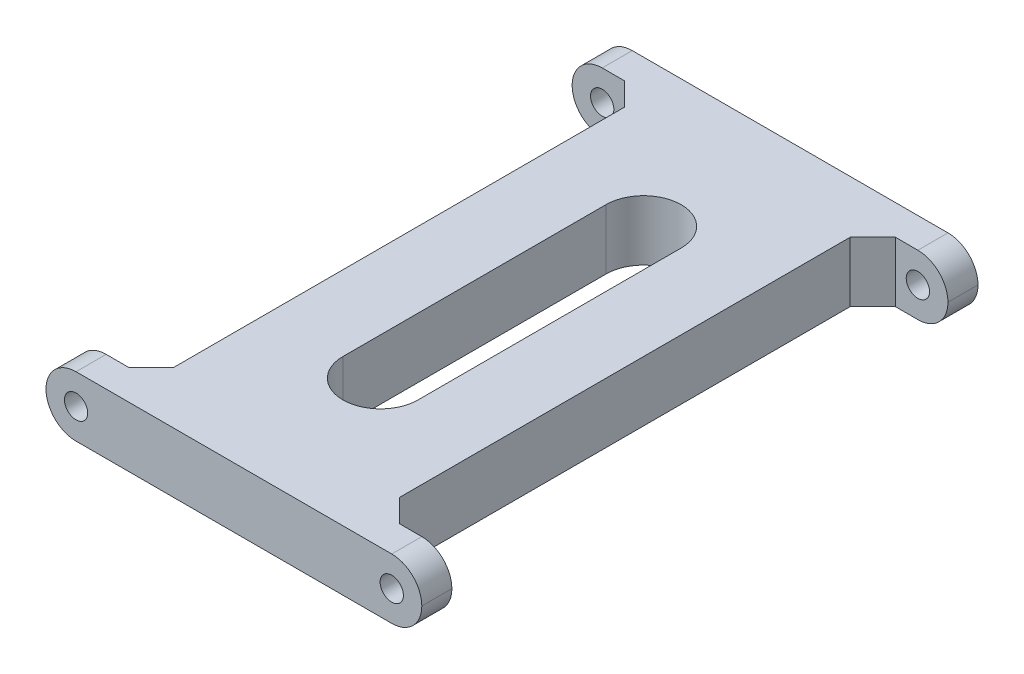
ISO-10303-21;
HEADER;
FILE_DESCRIPTION(('STEP AP214'),'2;1');
FILE_NAME('part.step','',(''),(''),'','','');
FILE_SCHEMA(('AUTOMOTIVE_DESIGN { 1 0 10303 214 1 1 1 1 }'));
ENDSEC;
DATA;
#1=APPLICATION_CONTEXT('core data for automotive mechanical design processes');
#2=APPLICATION_PROTOCOL_DEFINITION('international standard','automotive_design',2000,#1);
#3=PRODUCT_CONTEXT('',#1,'mechanical');
#4=PRODUCT('Part','Part','',(#3));
#5=PRODUCT_RELATED_PRODUCT_CATEGORY('part','',(#4));
#6=PRODUCT_DEFINITION_FORMATION('','',#4);
#7=PRODUCT_DEFINITION_CONTEXT('part definition',#1,'design');
#8=PRODUCT_DEFINITION('design','',#6,#7);
#9=PRODUCT_DEFINITION_SHAPE('','',#8);
#10=(LENGTH_UNIT() NAMED_UNIT(*) SI_UNIT(.MILLI.,.METRE.));
#11=(NAMED_UNIT(*) PLANE_ANGLE_UNIT() SI_UNIT($,.RADIAN.));
#12=(NAMED_UNIT(*) SI_UNIT($,.STERADIAN.) SOLID_ANGLE_UNIT());
#13=UNCERTAINTY_MEASURE_WITH_UNIT(LENGTH_MEASURE(1.E-05),#10,'distance_accuracy_value','');
#14=(GEOMETRIC_REPRESENTATION_CONTEXT(3) GLOBAL_UNCERTAINTY_ASSIGNED_CONTEXT((#13)) GLOBAL_UNIT_ASSIGNED_CONTEXT((#10,
#11,#12)) REPRESENTATION_CONTEXT('',''));
#15=CARTESIAN_POINT('',(0.,0.,0.));
#16=DIRECTION('',(0.,0.,1.));
#17=DIRECTION('',(1.,0.,0.));
#18=AXIS2_PLACEMENT_3D('',#15,#16,#17);
#19=CARTESIAN_POINT('',(0.,4.,0.));
#20=DIRECTION('',(0.,1.,0.));
#21=DIRECTION('',(0.,0.,1.));
#22=AXIS2_PLACEMENT_3D('',#19,#20,#21);
#23=PLANE('',#22);
#24=DIRECTION('',(-1.,0.,0.));
#25=VECTOR('',#24,1.);
#26=CARTESIAN_POINT('',(-25.,4.,-37.));
#27=LINE('',#26,#25);
#28=CARTESIAN_POINT('',(21.,4.,-37.));
#29=VERTEX_POINT('',#28);
#30=CARTESIAN_POINT('',(-21.,4.,-37.));
#31=VERTEX_POINT('',#30);
#32=EDGE_CURVE('E253',#29,#31,#27,.T.);
#33=ORIENTED_EDGE('',*,*,#32,.T.);
#34=DIRECTION('',(0.,0.,1.));
#35=VECTOR('',#34,1.);
#36=CARTESIAN_POINT('',(-21.,4.,-33.));
#37=LINE('',#36,#35);
#38=CARTESIAN_POINT('',(-21.,4.,-33.));
#39=VERTEX_POINT('',#38);
#40=EDGE_CURVE('E337',#31,#39,#37,.T.);
#41=ORIENTED_EDGE('',*,*,#40,.T.);
#42=DIRECTION('',(1.,0.,0.));
#43=VECTOR('',#42,1.);
#44=CARTESIAN_POINT('',(-25.,4.,-33.));
#45=LINE('',#44,#43);
#46=CARTESIAN_POINT('',(-18.,4.,-33.));
#47=VERTEX_POINT('',#46);
#48=EDGE_CURVE('E256',#39,#47,#45,.T.);
#49=ORIENTED_EDGE('',*,*,#48,.T.);
#50=DIRECTION('',(-0.707106781186543,0.,-0.707106781186552));
#51=VECTOR('',#50,1.);
#52=CARTESIAN_POINT('',(-15.,4.,-30.));
#53=LINE('',#52,#51);
#54=CARTESIAN_POINT('',(-15.,4.,-30.));
#55=VERTEX_POINT('',#54);
#56=EDGE_CURVE('E317',#47,#55,#53,.F.);
#57=ORIENTED_EDGE('',*,*,#56,.T.);
#58=DIRECTION('',(0.,0.,1.));
#59=VECTOR('',#58,1.);
#60=CARTESIAN_POINT('',(-15.,4.,-33.));
#61=LINE('',#60,#59);
#62=CARTESIAN_POINT('',(-15.,4.,30.));
#63=VERTEX_POINT('',#62);
#64=EDGE_CURVE('E258',#55,#63,#61,.T.);
#65=ORIENTED_EDGE('',*,*,#64,.T.);
#66=DIRECTION('',(0.707106781186553,0.,-0.707106781186542));
#67=VECTOR('',#66,1.);
#68=CARTESIAN_POINT('',(-18.,4.,33.));
#69=LINE('',#68,#67);
#70=CARTESIAN_POINT('',(-18.,4.,33.));
#71=VERTEX_POINT('',#70);
#72=EDGE_CURVE('E312',#63,#71,#69,.F.);
#73=ORIENTED_EDGE('',*,*,#72,.T.);
#74=DIRECTION('',(-1.,0.,0.));
#75=VECTOR('',#74,1.);
#76=CARTESIAN_POINT('',(-25.,4.,33.));
#77=LINE('',#76,#75);
#78=CARTESIAN_POINT('',(-21.,4.,33.));
#79=VERTEX_POINT('',#78);
#80=EDGE_CURVE('E261',#71,#79,#77,.T.);
#81=ORIENTED_EDGE('',*,*,#80,.T.);
#82=DIRECTION('',(0.,0.,1.));
#83=VECTOR('',#82,1.);
#84=CARTESIAN_POINT('',(-21.,4.,37.));
#85=LINE('',#84,#83);
#86=CARTESIAN_POINT('',(-21.,4.,37.));
#87=VERTEX_POINT('',#86);
#88=EDGE_CURVE('E323',#79,#87,#85,.T.);
#89=ORIENTED_EDGE('',*,*,#88,.T.);
#90=DIRECTION('',(1.,0.,0.));
#91=VECTOR('',#90,1.);
#92=CARTESIAN_POINT('',(-25.,4.,37.));
#93=LINE('',#92,#91);
#94=CARTESIAN_POINT('',(21.,4.,37.));
#95=VERTEX_POINT('',#94);
#96=EDGE_CURVE('E241',#87,#95,#93,.T.);
#97=ORIENTED_EDGE('',*,*,#96,.T.);
#98=DIRECTION('',(0.,0.,-1.));
#99=VECTOR('',#98,1.);
#100=CARTESIAN_POINT('',(21.,4.,33.));
#101=LINE('',#100,#99);
#102=CARTESIAN_POINT('',(21.,4.,33.));
#103=VERTEX_POINT('',#102);
#104=EDGE_CURVE('E331',#95,#103,#101,.T.);
#105=ORIENTED_EDGE('',*,*,#104,.T.);
#106=DIRECTION('',(-1.,0.,0.));
#107=VECTOR('',#106,1.);
#108=CARTESIAN_POINT('',(25.,4.,33.));
#109=LINE('',#108,#107);
#110=CARTESIAN_POINT('',(18.,4.,33.));
#111=VERTEX_POINT('',#110);
#112=EDGE_CURVE('E244',#103,#111,#109,.T.);
#113=ORIENTED_EDGE('',*,*,#112,.T.);
#114=DIRECTION('',(0.707106781186543,0.,0.707106781186552));
#115=VECTOR('',#114,1.);
#116=CARTESIAN_POINT('',(15.,4.,30.));
#117=LINE('',#116,#115);
#118=CARTESIAN_POINT('',(15.,4.,30.));
#119=VERTEX_POINT('',#118);
#120=EDGE_CURVE('E308',#111,#119,#117,.F.);
#121=ORIENTED_EDGE('',*,*,#120,.T.);
#122=DIRECTION('',(0.,0.,-1.));
#123=VECTOR('',#122,1.);
#124=CARTESIAN_POINT('',(15.,4.,-33.));
#125=LINE('',#124,#123);
#126=CARTESIAN_POINT('',(15.,4.,-30.));
#127=VERTEX_POINT('',#126);
#128=EDGE_CURVE('E247',#119,#127,#125,.T.);
#129=ORIENTED_EDGE('',*,*,#128,.T.);
#130=DIRECTION('',(-0.707106781186553,0.,0.707106781186542));
#131=VECTOR('',#130,1.);
#132=CARTESIAN_POINT('',(18.,4.,-33.));
#133=LINE('',#132,#131);
#134=CARTESIAN_POINT('',(18.,4.,-33.));
#135=VERTEX_POINT('',#134);
#136=EDGE_CURVE('E321',#127,#135,#133,.F.);
#137=ORIENTED_EDGE('',*,*,#136,.T.);
#138=DIRECTION('',(1.,0.,0.));
#139=VECTOR('',#138,1.);
#140=CARTESIAN_POINT('',(25.,4.,-33.));
#141=LINE('',#140,#139);
#142=CARTESIAN_POINT('',(21.,4.,-33.));
#143=VERTEX_POINT('',#142);
#144=EDGE_CURVE('E250',#135,#143,#141,.T.);
#145=ORIENTED_EDGE('',*,*,#144,.T.);
#146=DIRECTION('',(0.,0.,-1.));
#147=VECTOR('',#146,1.);
#148=CARTESIAN_POINT('',(21.,4.,-37.));
#149=LINE('',#148,#147);
#150=EDGE_CURVE('E334',#143,#29,#149,.T.);
#151=ORIENTED_EDGE('',*,*,#150,.T.);
#152=EDGE_LOOP('',(#33,#41,#49,#57,#65,#73,#81,#89,#97,#105,#113,#121,#129,#137,#145,#151));
#153=FACE_BOUND('',#152,.T.);
#154=DIRECTION('',(0.,0.,-1.));
#155=VECTOR('',#154,1.);
#156=CARTESIAN_POINT('',(5.,4.,17.5));
#157=LINE('',#156,#155);
#158=CARTESIAN_POINT('',(5.,4.,17.5));
#159=VERTEX_POINT('',#158);
#160=CARTESIAN_POINT('',(4.99999999999999,4.,-17.5));
#161=VERTEX_POINT('',#160);
#162=EDGE_CURVE('E208',#159,#161,#157,.T.);
#163=ORIENTED_EDGE('',*,*,#162,.F.);
#164=CARTESIAN_POINT('',(0.,4.,17.5));
#165=DIRECTION('',(0.,1.,0.));
#166=DIRECTION('',(0.,0.,1.));
#167=AXIS2_PLACEMENT_3D('',#164,#165,#166);
#168=CIRCLE('',#167,5.);
#169=CARTESIAN_POINT('',(-5.,4.,17.5));
#170=VERTEX_POINT('',#169);
#171=EDGE_CURVE('E198',#170,#159,#168,.T.);
#172=ORIENTED_EDGE('',*,*,#171,.F.);
#173=DIRECTION('',(0.,0.,1.));
#174=VECTOR('',#173,1.);
#175=CARTESIAN_POINT('',(-5.,4.,17.5));
#176=LINE('',#175,#174);
#177=CARTESIAN_POINT('',(-5.00000000000001,4.,-17.5));
#178=VERTEX_POINT('',#177);
#179=EDGE_CURVE('E223',#178,#170,#176,.T.);
#180=ORIENTED_EDGE('',*,*,#179,.F.);
#181=CARTESIAN_POINT('',(0.,4.,-17.5));
#182=DIRECTION('',(0.,1.,0.));
#183=DIRECTION('',(0.,0.,1.));
#184=AXIS2_PLACEMENT_3D('',#181,#182,#183);
#185=CIRCLE('',#184,5.);
#186=EDGE_CURVE('E221',#161,#178,#185,.T.);
#187=ORIENTED_EDGE('',*,*,#186,.F.);
#188=EDGE_LOOP('',(#163,#172,#180,#187));
#189=FACE_BOUND('',#188,.T.);
#190=ADVANCED_FACE('F34',(#153,#189),#23,.T.);
#191=CARTESIAN_POINT('',(0.,-4.,0.));
#192=DIRECTION('',(0.,1.,0.));
#193=DIRECTION('',(0.,0.,1.));
#194=AXIS2_PLACEMENT_3D('',#191,#192,#193);
#195=PLANE('',#194);
#196=DIRECTION('',(-1.,0.,0.));
#197=VECTOR('',#196,1.);
#198=CARTESIAN_POINT('',(25.,-4.,33.));
#199=LINE('',#198,#197);
#200=CARTESIAN_POINT('',(21.,-4.,33.));
#201=VERTEX_POINT('',#200);
#202=CARTESIAN_POINT('',(18.,-4.,33.));
#203=VERTEX_POINT('',#202);
#204=EDGE_CURVE('E267',#201,#203,#199,.T.);
#205=ORIENTED_EDGE('',*,*,#204,.F.);
#206=DIRECTION('',(0.,0.,-1.));
#207=VECTOR('',#206,1.);
#208=CARTESIAN_POINT('',(21.,-4.,0.));
#209=LINE('',#208,#207);
#210=CARTESIAN_POINT('',(21.,-4.,37.));
#211=VERTEX_POINT('',#210);
#212=EDGE_CURVE('E11',#201,#211,#209,.F.);
#213=ORIENTED_EDGE('',*,*,#212,.T.);
#214=DIRECTION('',(1.,0.,0.));
#215=VECTOR('',#214,1.);
#216=CARTESIAN_POINT('',(-25.,-4.,37.));
#217=LINE('',#216,#215);
#218=CARTESIAN_POINT('',(-21.,-4.,37.));
#219=VERTEX_POINT('',#218);
#220=EDGE_CURVE('E216',#219,#211,#217,.T.);
#221=ORIENTED_EDGE('',*,*,#220,.F.);
#222=DIRECTION('',(0.,0.,1.));
#223=VECTOR('',#222,1.);
#224=CARTESIAN_POINT('',(-21.,-4.,0.));
#225=LINE('',#224,#223);
#226=CARTESIAN_POINT('',(-21.,-4.,33.));
#227=VERTEX_POINT('',#226);
#228=EDGE_CURVE('E43',#219,#227,#225,.F.);
#229=ORIENTED_EDGE('',*,*,#228,.T.);
#230=DIRECTION('',(-1.,0.,0.));
#231=VECTOR('',#230,1.);
#232=CARTESIAN_POINT('',(-25.,-4.,33.));
#233=LINE('',#232,#231);
#234=CARTESIAN_POINT('',(-18.,-4.,33.));
#235=VERTEX_POINT('',#234);
#236=EDGE_CURVE('E245',#235,#227,#233,.T.);
#237=ORIENTED_EDGE('',*,*,#236,.F.);
#238=DIRECTION('',(-0.707106781186553,0.,0.707106781186542));
#239=VECTOR('',#238,1.);
#240=CARTESIAN_POINT('',(7.50000000000011,-4.,7.50000000000022));
#241=LINE('',#240,#239);
#242=CARTESIAN_POINT('',(-15.,-4.,30.));
#243=VERTEX_POINT('',#242);
#244=EDGE_CURVE('E310',#235,#243,#241,.F.);
#245=ORIENTED_EDGE('',*,*,#244,.T.);
#246=DIRECTION('',(0.,0.,1.));
#247=VECTOR('',#246,1.);
#248=CARTESIAN_POINT('',(-15.,-4.,-33.));
#249=LINE('',#248,#247);
#250=CARTESIAN_POINT('',(-15.,-4.,-30.));
#251=VERTEX_POINT('',#250);
#252=EDGE_CURVE('E280',#251,#243,#249,.T.);
#253=ORIENTED_EDGE('',*,*,#252,.F.);
#254=DIRECTION('',(0.707106781186543,0.,0.707106781186552));
#255=VECTOR('',#254,1.);
#256=CARTESIAN_POINT('',(7.49999999999988,-4.,-7.49999999999978));
#257=LINE('',#256,#255);
#258=CARTESIAN_POINT('',(-18.,-4.,-33.));
#259=VERTEX_POINT('',#258);
#260=EDGE_CURVE('E314',#251,#259,#257,.F.);
#261=ORIENTED_EDGE('',*,*,#260,.T.);
#262=DIRECTION('',(1.,0.,0.));
#263=VECTOR('',#262,1.);
#264=CARTESIAN_POINT('',(-25.,-4.,-33.));
#265=LINE('',#264,#263);
#266=CARTESIAN_POINT('',(-21.,-4.,-33.));
#267=VERTEX_POINT('',#266);
#268=EDGE_CURVE('E278',#267,#259,#265,.T.);
#269=ORIENTED_EDGE('',*,*,#268,.F.);
#270=DIRECTION('',(0.,0.,1.));
#271=VECTOR('',#270,1.);
#272=CARTESIAN_POINT('',(-21.,-4.,0.));
#273=LINE('',#272,#271);
#274=CARTESIAN_POINT('',(-21.,-4.,-37.));
#275=VERTEX_POINT('',#274);
#276=EDGE_CURVE('E371',#267,#275,#273,.F.);
#277=ORIENTED_EDGE('',*,*,#276,.T.);
#278=DIRECTION('',(-1.,0.,0.));
#279=VECTOR('',#278,1.);
#280=CARTESIAN_POINT('',(-25.,-4.,-37.));
#281=LINE('',#280,#279);
#282=CARTESIAN_POINT('',(21.,-4.,-37.));
#283=VERTEX_POINT('',#282);
#284=EDGE_CURVE('E275',#283,#275,#281,.T.);
#285=ORIENTED_EDGE('',*,*,#284,.F.);
#286=DIRECTION('',(0.,0.,-1.));
#287=VECTOR('',#286,1.);
#288=CARTESIAN_POINT('',(21.,-4.,0.));
#289=LINE('',#288,#287);
#290=CARTESIAN_POINT('',(21.,-4.,-33.));
#291=VERTEX_POINT('',#290);
#292=EDGE_CURVE('E373',#283,#291,#289,.F.);
#293=ORIENTED_EDGE('',*,*,#292,.T.);
#294=DIRECTION('',(1.,0.,0.));
#295=VECTOR('',#294,1.);
#296=CARTESIAN_POINT('',(25.,-4.,-33.));
#297=LINE('',#296,#295);
#298=CARTESIAN_POINT('',(18.,-4.,-33.));
#299=VERTEX_POINT('',#298);
#300=EDGE_CURVE('E272',#299,#291,#297,.T.);
#301=ORIENTED_EDGE('',*,*,#300,.F.);
#302=DIRECTION('',(0.707106781186553,0.,-0.707106781186542));
#303=VECTOR('',#302,1.);
#304=CARTESIAN_POINT('',(-7.50000000000011,-4.,-7.50000000000022));
#305=LINE('',#304,#303);
#306=CARTESIAN_POINT('',(15.,-4.,-30.));
#307=VERTEX_POINT('',#306);
#308=EDGE_CURVE('E319',#299,#307,#305,.F.);
#309=ORIENTED_EDGE('',*,*,#308,.T.);
#310=DIRECTION('',(0.,0.,-1.));
#311=VECTOR('',#310,1.);
#312=CARTESIAN_POINT('',(15.,-4.,-33.));
#313=LINE('',#312,#311);
#314=CARTESIAN_POINT('',(15.,-4.,30.));
#315=VERTEX_POINT('',#314);
#316=EDGE_CURVE('E269',#315,#307,#313,.T.);
#317=ORIENTED_EDGE('',*,*,#316,.F.);
#318=DIRECTION('',(-0.707106781186543,0.,-0.707106781186552));
#319=VECTOR('',#318,1.);
#320=CARTESIAN_POINT('',(-7.49999999999988,-4.,7.49999999999978));
#321=LINE('',#320,#319);
#322=EDGE_CURVE('E305',#315,#203,#321,.F.);
#323=ORIENTED_EDGE('',*,*,#322,.T.);
#324=EDGE_LOOP('',(#205,#213,#221,#229,#237,#245,#253,#261,#269,#277,#285,#293,#301,#309,#317,#323));
#325=FACE_BOUND('',#324,.T.);
#326=CARTESIAN_POINT('',(0.,-4.,17.5));
#327=DIRECTION('',(0.,1.,0.));
#328=DIRECTION('',(0.,0.,1.));
#329=AXIS2_PLACEMENT_3D('',#326,#327,#328);
#330=CIRCLE('',#329,5.);
#331=CARTESIAN_POINT('',(-5.,-4.,17.5));
#332=VERTEX_POINT('',#331);
#333=CARTESIAN_POINT('',(5.,-4.,17.5));
#334=VERTEX_POINT('',#333);
#335=EDGE_CURVE('E228',#332,#334,#330,.T.);
#336=ORIENTED_EDGE('',*,*,#335,.T.);
#337=DIRECTION('',(0.,0.,-1.));
#338=VECTOR('',#337,1.);
#339=CARTESIAN_POINT('',(5.,-4.,17.5));
#340=LINE('',#339,#338);
#341=CARTESIAN_POINT('',(4.99999999999999,-4.,-17.5));
#342=VERTEX_POINT('',#341);
#343=EDGE_CURVE('E215',#334,#342,#340,.T.);
#344=ORIENTED_EDGE('',*,*,#343,.T.);
#345=CARTESIAN_POINT('',(0.,-4.,-17.5));
#346=DIRECTION('',(0.,1.,0.));
#347=DIRECTION('',(0.,0.,1.));
#348=AXIS2_PLACEMENT_3D('',#345,#346,#347);
#349=CIRCLE('',#348,5.);
#350=CARTESIAN_POINT('',(-5.00000000000001,-4.,-17.5));
#351=VERTEX_POINT('',#350);
#352=EDGE_CURVE('E232',#342,#351,#349,.T.);
#353=ORIENTED_EDGE('',*,*,#352,.T.);
#354=DIRECTION('',(0.,0.,1.));
#355=VECTOR('',#354,1.);
#356=CARTESIAN_POINT('',(-5.,-4.,17.5));
#357=LINE('',#356,#355);
#358=EDGE_CURVE('E209',#351,#332,#357,.T.);
#359=ORIENTED_EDGE('',*,*,#358,.T.);
#360=EDGE_LOOP('',(#336,#344,#353,#359));
#361=FACE_BOUND('',#360,.T.);
#362=ADVANCED_FACE('F399',(#325,#361),#195,.F.);
#363=CARTESIAN_POINT('',(-25.,4.,37.));
#364=DIRECTION('',(0.,0.,-1.));
#365=DIRECTION('',(-1.,0.,0.));
#366=AXIS2_PLACEMENT_3D('',#363,#364,#365);
#367=PLANE('',#366);
#368=CARTESIAN_POINT('',(-21.,0.,37.));
#369=DIRECTION('',(0.,0.,1.));
#370=DIRECTION('',(1.,0.,0.));
#371=AXIS2_PLACEMENT_3D('',#368,#369,#370);
#372=CIRCLE('',#371,1.55);
#373=CARTESIAN_POINT('',(-19.45,0.,37.));
#374=VERTEX_POINT('',#373);
#375=EDGE_CURVE('E686',#374,#374,#372,.T.);
#376=ORIENTED_EDGE('',*,*,#375,.F.);
#377=EDGE_LOOP('',(#376));
#378=FACE_BOUND('',#377,.T.);
#379=CARTESIAN_POINT('',(21.,0.,37.));
#380=DIRECTION('',(0.,0.,1.));
#381=DIRECTION('',(-1.,0.,0.));
#382=AXIS2_PLACEMENT_3D('',#379,#380,#381);
#383=CIRCLE('',#382,1.55);
#384=CARTESIAN_POINT('',(19.45,0.,37.));
#385=VERTEX_POINT('',#384);
#386=EDGE_CURVE('E379',#385,#385,#383,.T.);
#387=ORIENTED_EDGE('',*,*,#386,.F.);
#388=EDGE_LOOP('',(#387));
#389=FACE_BOUND('',#388,.T.);
#390=CARTESIAN_POINT('',(21.,0.,37.));
#391=DIRECTION('',(0.,0.,-1.));
#392=DIRECTION('',(-1.,0.,0.));
#393=AXIS2_PLACEMENT_3D('',#390,#391,#392);
#394=CIRCLE('',#393,4.);
#395=CARTESIAN_POINT('',(25.,0.,37.));
#396=VERTEX_POINT('',#395);
#397=EDGE_CURVE('E364',#211,#396,#394,.F.);
#398=ORIENTED_EDGE('',*,*,#397,.T.);
#399=CARTESIAN_POINT('',(21.,0.,37.));
#400=DIRECTION('',(0.,0.,-1.));
#401=DIRECTION('',(-1.,0.,0.));
#402=AXIS2_PLACEMENT_3D('',#399,#400,#401);
#403=CIRCLE('',#402,4.);
#404=EDGE_CURVE('E366',#396,#95,#403,.F.);
#405=ORIENTED_EDGE('',*,*,#404,.T.);
#406=ORIENTED_EDGE('',*,*,#96,.F.);
#407=CARTESIAN_POINT('',(-21.,0.,37.));
#408=DIRECTION('',(0.,0.,-1.));
#409=DIRECTION('',(-1.,0.,0.));
#410=AXIS2_PLACEMENT_3D('',#407,#408,#409);
#411=CIRCLE('',#410,4.);
#412=CARTESIAN_POINT('',(-25.,0.,37.));
#413=VERTEX_POINT('',#412);
#414=EDGE_CURVE('E362',#87,#413,#411,.F.);
#415=ORIENTED_EDGE('',*,*,#414,.T.);
#416=CARTESIAN_POINT('',(-21.,0.,37.));
#417=DIRECTION('',(0.,0.,-1.));
#418=DIRECTION('',(-1.,0.,0.));
#419=AXIS2_PLACEMENT_3D('',#416,#417,#418);
#420=CIRCLE('',#419,4.);
#421=EDGE_CURVE('E360',#413,#219,#420,.F.);
#422=ORIENTED_EDGE('',*,*,#421,.T.);
#423=ORIENTED_EDGE('',*,*,#220,.T.);
#424=EDGE_LOOP('',(#398,#405,#406,#415,#422,#423));
#425=FACE_BOUND('',#424,.T.);
#426=ADVANCED_FACE('F395',(#378,#389,#425),#367,.F.);
#427=CARTESIAN_POINT('',(25.,4.,33.));
#428=DIRECTION('',(0.,0.,1.));
#429=DIRECTION('',(1.,0.,0.));
#430=AXIS2_PLACEMENT_3D('',#427,#428,#429);
#431=PLANE('',#430);
#432=CARTESIAN_POINT('',(21.,0.,33.));
#433=DIRECTION('',(0.,0.,1.));
#434=DIRECTION('',(1.,0.,0.));
#435=AXIS2_PLACEMENT_3D('',#432,#433,#434);
#436=CIRCLE('',#435,1.55);
#437=CARTESIAN_POINT('',(22.55,0.,33.));
#438=VERTEX_POINT('',#437);
#439=EDGE_CURVE('E230',#438,#438,#436,.T.);
#440=ORIENTED_EDGE('',*,*,#439,.T.);
#441=EDGE_LOOP('',(#440));
#442=FACE_BOUND('',#441,.T.);
#443=ORIENTED_EDGE('',*,*,#112,.F.);
#444=CARTESIAN_POINT('',(21.,0.,33.));
#445=DIRECTION('',(0.,0.,1.));
#446=DIRECTION('',(1.,0.,0.));
#447=AXIS2_PLACEMENT_3D('',#444,#445,#446);
#448=CIRCLE('',#447,4.);
#449=CARTESIAN_POINT('',(25.,0.,33.));
#450=VERTEX_POINT('',#449);
#451=EDGE_CURVE('E358',#103,#450,#448,.F.);
#452=ORIENTED_EDGE('',*,*,#451,.T.);
#453=CARTESIAN_POINT('',(21.,0.,33.));
#454=DIRECTION('',(0.,0.,1.));
#455=DIRECTION('',(1.,0.,0.));
#456=AXIS2_PLACEMENT_3D('',#453,#454,#455);
#457=CIRCLE('',#456,4.);
#458=EDGE_CURVE('E356',#450,#201,#457,.F.);
#459=ORIENTED_EDGE('',*,*,#458,.T.);
#460=ORIENTED_EDGE('',*,*,#204,.T.);
#461=DIRECTION('',(0.,1.,0.));
#462=VECTOR('',#461,1.);
#463=CARTESIAN_POINT('',(18.,4.,33.));
#464=LINE('',#463,#462);
#465=EDGE_CURVE('E288',#203,#111,#464,.T.);
#466=ORIENTED_EDGE('',*,*,#465,.T.);
#467=EDGE_LOOP('',(#443,#452,#459,#460,#466));
#468=FACE_BOUND('',#467,.T.);
#469=ADVANCED_FACE('F410',(#442,#468),#431,.F.);
#470=CARTESIAN_POINT('',(15.,4.,-33.));
#471=DIRECTION('',(-1.,0.,0.));
#472=DIRECTION('',(0.,0.,1.));
#473=AXIS2_PLACEMENT_3D('',#470,#471,#472);
#474=PLANE('',#473);
#475=ORIENTED_EDGE('',*,*,#128,.F.);
#476=DIRECTION('',(0.,-1.,0.));
#477=VECTOR('',#476,1.);
#478=CARTESIAN_POINT('',(15.,-4.,30.));
#479=LINE('',#478,#477);
#480=EDGE_CURVE('E285',#119,#315,#479,.T.);
#481=ORIENTED_EDGE('',*,*,#480,.T.);
#482=ORIENTED_EDGE('',*,*,#316,.T.);
#483=DIRECTION('',(0.,1.,0.));
#484=VECTOR('',#483,1.);
#485=CARTESIAN_POINT('',(15.,4.,-30.));
#486=LINE('',#485,#484);
#487=EDGE_CURVE('E264',#307,#127,#486,.T.);
#488=ORIENTED_EDGE('',*,*,#487,.T.);
#489=EDGE_LOOP('',(#475,#481,#482,#488));
#490=FACE_BOUND('',#489,.T.);
#491=ADVANCED_FACE('F418',(#490),#474,.F.);
#492=CARTESIAN_POINT('',(25.,4.,-33.));
#493=DIRECTION('',(0.,0.,-1.));
#494=DIRECTION('',(-1.,0.,0.));
#495=AXIS2_PLACEMENT_3D('',#492,#493,#494);
#496=PLANE('',#495);
#497=CARTESIAN_POINT('',(21.,0.,-33.));
#498=DIRECTION('',(0.,0.,-1.));
#499=DIRECTION('',(-1.,0.,0.));
#500=AXIS2_PLACEMENT_3D('',#497,#498,#499);
#501=CIRCLE('',#500,1.55);
#502=CARTESIAN_POINT('',(19.45,0.,-33.));
#503=VERTEX_POINT('',#502);
#504=EDGE_CURVE('E679',#503,#503,#501,.T.);
#505=ORIENTED_EDGE('',*,*,#504,.T.);
#506=EDGE_LOOP('',(#505));
#507=FACE_BOUND('',#506,.T.);
#508=CARTESIAN_POINT('',(21.,0.,-33.));
#509=DIRECTION('',(0.,0.,-1.));
#510=DIRECTION('',(-1.,0.,0.));
#511=AXIS2_PLACEMENT_3D('',#508,#509,#510);
#512=CIRCLE('',#511,4.);
#513=CARTESIAN_POINT('',(25.,0.,-33.));
#514=VERTEX_POINT('',#513);
#515=EDGE_CURVE('E352',#291,#514,#512,.F.);
#516=ORIENTED_EDGE('',*,*,#515,.T.);
#517=CARTESIAN_POINT('',(21.,0.,-33.));
#518=DIRECTION('',(0.,0.,-1.));
#519=DIRECTION('',(-1.,0.,0.));
#520=AXIS2_PLACEMENT_3D('',#517,#518,#519);
#521=CIRCLE('',#520,4.);
#522=EDGE_CURVE('E354',#514,#143,#521,.F.);
#523=ORIENTED_EDGE('',*,*,#522,.T.);
#524=ORIENTED_EDGE('',*,*,#144,.F.);
#525=DIRECTION('',(0.,-1.,0.));
#526=VECTOR('',#525,1.);
#527=CARTESIAN_POINT('',(18.,-4.,-33.));
#528=LINE('',#527,#526);
#529=EDGE_CURVE('E302',#135,#299,#528,.T.);
#530=ORIENTED_EDGE('',*,*,#529,.T.);
#531=ORIENTED_EDGE('',*,*,#300,.T.);
#532=EDGE_LOOP('',(#516,#523,#524,#530,#531));
#533=FACE_BOUND('',#532,.T.);
#534=ADVANCED_FACE('F429',(#507,#533),#496,.F.);
#535=CARTESIAN_POINT('',(-25.,4.,-37.));
#536=DIRECTION('',(0.,0.,1.));
#537=DIRECTION('',(1.,0.,0.));
#538=AXIS2_PLACEMENT_3D('',#535,#536,#537);
#539=PLANE('',#538);
#540=CARTESIAN_POINT('',(-21.,0.,-37.));
#541=DIRECTION('',(0.,0.,1.));
#542=DIRECTION('',(1.,0.,0.));
#543=AXIS2_PLACEMENT_3D('',#540,#541,#542);
#544=CIRCLE('',#543,1.55);
#545=CARTESIAN_POINT('',(-19.45,0.,-37.));
#546=VERTEX_POINT('',#545);
#547=EDGE_CURVE('E328',#546,#546,#544,.T.);
#548=ORIENTED_EDGE('',*,*,#547,.T.);
#549=EDGE_LOOP('',(#548));
#550=FACE_BOUND('',#549,.T.);
#551=CARTESIAN_POINT('',(21.,0.,-37.));
#552=DIRECTION('',(0.,0.,1.));
#553=DIRECTION('',(-1.,0.,0.));
#554=AXIS2_PLACEMENT_3D('',#551,#552,#553);
#555=CIRCLE('',#554,1.55);
#556=CARTESIAN_POINT('',(19.45,0.,-37.));
#557=VERTEX_POINT('',#556);
#558=EDGE_CURVE('E676',#557,#557,#555,.T.);
#559=ORIENTED_EDGE('',*,*,#558,.T.);
#560=EDGE_LOOP('',(#559));
#561=FACE_BOUND('',#560,.T.);
#562=ORIENTED_EDGE('',*,*,#32,.F.);
#563=CARTESIAN_POINT('',(21.,0.,-37.));
#564=DIRECTION('',(0.,0.,1.));
#565=DIRECTION('',(1.,0.,0.));
#566=AXIS2_PLACEMENT_3D('',#563,#564,#565);
#567=CIRCLE('',#566,4.);
#568=CARTESIAN_POINT('',(25.,0.,-37.));
#569=VERTEX_POINT('',#568);
#570=EDGE_CURVE('E350',#29,#569,#567,.F.);
#571=ORIENTED_EDGE('',*,*,#570,.T.);
#572=CARTESIAN_POINT('',(21.,0.,-37.));
#573=DIRECTION('',(0.,0.,1.));
#574=DIRECTION('',(1.,0.,0.));
#575=AXIS2_PLACEMENT_3D('',#572,#573,#574);
#576=CIRCLE('',#575,4.);
#577=EDGE_CURVE('E348',#569,#283,#576,.F.);
#578=ORIENTED_EDGE('',*,*,#577,.T.);
#579=ORIENTED_EDGE('',*,*,#284,.T.);
#580=CARTESIAN_POINT('',(-21.,0.,-37.));
#581=DIRECTION('',(0.,0.,1.));
#582=DIRECTION('',(1.,0.,0.));
#583=AXIS2_PLACEMENT_3D('',#580,#581,#582);
#584=CIRCLE('',#583,4.);
#585=CARTESIAN_POINT('',(-25.,0.,-37.));
#586=VERTEX_POINT('',#585);
#587=EDGE_CURVE('E344',#275,#586,#584,.F.);
#588=ORIENTED_EDGE('',*,*,#587,.T.);
#589=CARTESIAN_POINT('',(-21.,0.,-37.));
#590=DIRECTION('',(0.,0.,1.));
#591=DIRECTION('',(1.,0.,0.));
#592=AXIS2_PLACEMENT_3D('',#589,#590,#591);
#593=CIRCLE('',#592,4.);
#594=EDGE_CURVE('E346',#586,#31,#593,.F.);
#595=ORIENTED_EDGE('',*,*,#594,.T.);
#596=EDGE_LOOP('',(#562,#571,#578,#579,#588,#595));
#597=FACE_BOUND('',#596,.T.);
#598=ADVANCED_FACE('F438',(#550,#561,#597),#539,.F.);
#599=CARTESIAN_POINT('',(-25.,4.,-33.));
#600=DIRECTION('',(0.,0.,-1.));
#601=DIRECTION('',(-1.,0.,0.));
#602=AXIS2_PLACEMENT_3D('',#599,#600,#601);
#603=PLANE('',#602);
#604=CARTESIAN_POINT('',(-21.,0.,-33.));
#605=DIRECTION('',(0.,0.,-1.));
#606=DIRECTION('',(-1.,0.,0.));
#607=AXIS2_PLACEMENT_3D('',#604,#605,#606);
#608=CIRCLE('',#607,1.55);
#609=CARTESIAN_POINT('',(-22.55,0.,-33.));
#610=VERTEX_POINT('',#609);
#611=EDGE_CURVE('E327',#610,#610,#608,.T.);
#612=ORIENTED_EDGE('',*,*,#611,.T.);
#613=EDGE_LOOP('',(#612));
#614=FACE_BOUND('',#613,.T.);
#615=ORIENTED_EDGE('',*,*,#48,.F.);
#616=CARTESIAN_POINT('',(-21.,0.,-33.));
#617=DIRECTION('',(0.,0.,-1.));
#618=DIRECTION('',(-1.,0.,0.));
#619=AXIS2_PLACEMENT_3D('',#616,#617,#618);
#620=CIRCLE('',#619,4.);
#621=CARTESIAN_POINT('',(-25.,0.,-33.));
#622=VERTEX_POINT('',#621);
#623=EDGE_CURVE('E342',#39,#622,#620,.F.);
#624=ORIENTED_EDGE('',*,*,#623,.T.);
#625=CARTESIAN_POINT('',(-21.,0.,-33.));
#626=DIRECTION('',(0.,0.,-1.));
#627=DIRECTION('',(-1.,0.,0.));
#628=AXIS2_PLACEMENT_3D('',#625,#626,#627);
#629=CIRCLE('',#628,4.);
#630=EDGE_CURVE('E340',#622,#267,#629,.F.);
#631=ORIENTED_EDGE('',*,*,#630,.T.);
#632=ORIENTED_EDGE('',*,*,#268,.T.);
#633=DIRECTION('',(0.,1.,0.));
#634=VECTOR('',#633,1.);
#635=CARTESIAN_POINT('',(-18.,4.,-33.));
#636=LINE('',#635,#634);
#637=EDGE_CURVE('E299',#259,#47,#636,.T.);
#638=ORIENTED_EDGE('',*,*,#637,.T.);
#639=EDGE_LOOP('',(#615,#624,#631,#632,#638));
#640=FACE_BOUND('',#639,.T.);
#641=ADVANCED_FACE('F447',(#614,#640),#603,.F.);
#642=CARTESIAN_POINT('',(-15.,4.,-33.));
#643=DIRECTION('',(1.,0.,0.));
#644=DIRECTION('',(0.,0.,-1.));
#645=AXIS2_PLACEMENT_3D('',#642,#643,#644);
#646=PLANE('',#645);
#647=ORIENTED_EDGE('',*,*,#252,.T.);
#648=DIRECTION('',(0.,1.,0.));
#649=VECTOR('',#648,1.);
#650=CARTESIAN_POINT('',(-15.,4.,30.));
#651=LINE('',#650,#649);
#652=EDGE_CURVE('E297',#243,#63,#651,.T.);
#653=ORIENTED_EDGE('',*,*,#652,.T.);
#654=ORIENTED_EDGE('',*,*,#64,.F.);
#655=DIRECTION('',(0.,-1.,0.));
#656=VECTOR('',#655,1.);
#657=CARTESIAN_POINT('',(-15.,-4.,-30.));
#658=LINE('',#657,#656);
#659=EDGE_CURVE('E294',#55,#251,#658,.T.);
#660=ORIENTED_EDGE('',*,*,#659,.T.);
#661=EDGE_LOOP('',(#647,#653,#654,#660));
#662=FACE_BOUND('',#661,.T.);
#663=ADVANCED_FACE('F458',(#662),#646,.F.);
#664=CARTESIAN_POINT('',(-25.,4.,33.));
#665=DIRECTION('',(0.,0.,1.));
#666=DIRECTION('',(1.,0.,0.));
#667=AXIS2_PLACEMENT_3D('',#664,#665,#666);
#668=PLANE('',#667);
#669=CARTESIAN_POINT('',(-21.,0.,33.));
#670=DIRECTION('',(0.,0.,1.));
#671=DIRECTION('',(1.,0.,0.));
#672=AXIS2_PLACEMENT_3D('',#669,#670,#671);
#673=CIRCLE('',#672,1.55);
#674=CARTESIAN_POINT('',(-19.45,0.,33.));
#675=VERTEX_POINT('',#674);
#676=EDGE_CURVE('E324',#675,#675,#673,.T.);
#677=ORIENTED_EDGE('',*,*,#676,.T.);
#678=EDGE_LOOP('',(#677));
#679=FACE_BOUND('',#678,.T.);
#680=CARTESIAN_POINT('',(-21.,0.,33.));
#681=DIRECTION('',(0.,0.,1.));
#682=DIRECTION('',(1.,0.,0.));
#683=AXIS2_PLACEMENT_3D('',#680,#681,#682);
#684=CIRCLE('',#683,4.);
#685=CARTESIAN_POINT('',(-25.,0.,33.));
#686=VERTEX_POINT('',#685);
#687=EDGE_CURVE('E51',#227,#686,#684,.F.);
#688=ORIENTED_EDGE('',*,*,#687,.T.);
#689=CARTESIAN_POINT('',(-21.,0.,33.));
#690=DIRECTION('',(0.,0.,1.));
#691=DIRECTION('',(1.,0.,0.));
#692=AXIS2_PLACEMENT_3D('',#689,#690,#691);
#693=CIRCLE('',#692,4.);
#694=EDGE_CURVE('E369',#686,#79,#693,.F.);
#695=ORIENTED_EDGE('',*,*,#694,.T.);
#696=ORIENTED_EDGE('',*,*,#80,.F.);
#697=DIRECTION('',(0.,-1.,0.));
#698=VECTOR('',#697,1.);
#699=CARTESIAN_POINT('',(-18.,-4.,33.));
#700=LINE('',#699,#698);
#701=EDGE_CURVE('E291',#71,#235,#700,.T.);
#702=ORIENTED_EDGE('',*,*,#701,.T.);
#703=ORIENTED_EDGE('',*,*,#236,.T.);
#704=EDGE_LOOP('',(#688,#695,#696,#702,#703));
#705=FACE_BOUND('',#704,.T.);
#706=ADVANCED_FACE('F465',(#679,#705),#668,.F.);
#707=CARTESIAN_POINT('',(0.,4.,17.5));
#708=DIRECTION('',(0.,-1.,0.));
#709=DIRECTION('',(0.,0.,-1.));
#710=AXIS2_PLACEMENT_3D('',#707,#708,#709);
#711=CYLINDRICAL_SURFACE('',#710,5.);
#712=ORIENTED_EDGE('',*,*,#335,.F.);
#713=DIRECTION('',(0.,-1.,0.));
#714=VECTOR('',#713,1.);
#715=CARTESIAN_POINT('',(-5.,4.,17.5));
#716=LINE('',#715,#714);
#717=EDGE_CURVE('E204',#170,#332,#716,.T.);
#718=ORIENTED_EDGE('',*,*,#717,.F.);
#719=ORIENTED_EDGE('',*,*,#171,.T.);
#720=DIRECTION('',(0.,-1.,0.));
#721=VECTOR('',#720,1.);
#722=CARTESIAN_POINT('',(5.,4.,17.5));
#723=LINE('',#722,#721);
#724=EDGE_CURVE('E201',#159,#334,#723,.T.);
#725=ORIENTED_EDGE('',*,*,#724,.T.);
#726=EDGE_LOOP('',(#712,#718,#719,#725));
#727=FACE_BOUND('',#726,.T.);
#728=ADVANCED_FACE('F200',(#727),#711,.F.);
#729=CARTESIAN_POINT('',(5.,4.,17.5));
#730=DIRECTION('',(-1.,0.,0.));
#731=DIRECTION('',(0.,0.,1.));
#732=AXIS2_PLACEMENT_3D('',#729,#730,#731);
#733=PLANE('',#732);
#734=ORIENTED_EDGE('',*,*,#343,.F.);
#735=ORIENTED_EDGE('',*,*,#724,.F.);
#736=ORIENTED_EDGE('',*,*,#162,.T.);
#737=DIRECTION('',(0.,-1.,0.));
#738=VECTOR('',#737,1.);
#739=CARTESIAN_POINT('',(4.99999999999999,4.,-17.5));
#740=LINE('',#739,#738);
#741=EDGE_CURVE('E217',#161,#342,#740,.T.);
#742=ORIENTED_EDGE('',*,*,#741,.T.);
#743=EDGE_LOOP('',(#734,#735,#736,#742));
#744=FACE_BOUND('',#743,.T.);
#745=ADVANCED_FACE('F212',(#744),#733,.T.);
#746=CARTESIAN_POINT('',(0.,4.,-17.5));
#747=DIRECTION('',(0.,-1.,0.));
#748=DIRECTION('',(0.,0.,-1.));
#749=AXIS2_PLACEMENT_3D('',#746,#747,#748);
#750=CYLINDRICAL_SURFACE('',#749,5.);
#751=ORIENTED_EDGE('',*,*,#352,.F.);
#752=ORIENTED_EDGE('',*,*,#741,.F.);
#753=ORIENTED_EDGE('',*,*,#186,.T.);
#754=DIRECTION('',(0.,-1.,0.));
#755=VECTOR('',#754,1.);
#756=CARTESIAN_POINT('',(-5.00000000000001,4.,-17.5));
#757=LINE('',#756,#755);
#758=EDGE_CURVE('E238',#178,#351,#757,.T.);
#759=ORIENTED_EDGE('',*,*,#758,.T.);
#760=EDGE_LOOP('',(#751,#752,#753,#759));
#761=FACE_BOUND('',#760,.T.);
#762=ADVANCED_FACE('F538',(#761),#750,.F.);
#763=CARTESIAN_POINT('',(-5.,4.,17.5));
#764=DIRECTION('',(1.,0.,0.));
#765=DIRECTION('',(0.,0.,-1.));
#766=AXIS2_PLACEMENT_3D('',#763,#764,#765);
#767=PLANE('',#766);
#768=ORIENTED_EDGE('',*,*,#358,.F.);
#769=ORIENTED_EDGE('',*,*,#758,.F.);
#770=ORIENTED_EDGE('',*,*,#179,.T.);
#771=ORIENTED_EDGE('',*,*,#717,.T.);
#772=EDGE_LOOP('',(#768,#769,#770,#771));
#773=FACE_BOUND('',#772,.T.);
#774=ADVANCED_FACE('F516',(#773),#767,.T.);
#775=CARTESIAN_POINT('',(15.,4.,30.));
#776=DIRECTION('',(0.707106781186552,0.,-0.707106781186543));
#777=DIRECTION('',(0.,1.,0.));
#778=AXIS2_PLACEMENT_3D('',#775,#776,#777);
#779=PLANE('',#778);
#780=ORIENTED_EDGE('',*,*,#120,.F.);
#781=ORIENTED_EDGE('',*,*,#465,.F.);
#782=ORIENTED_EDGE('',*,*,#322,.F.);
#783=ORIENTED_EDGE('',*,*,#480,.F.);
#784=EDGE_LOOP('',(#780,#781,#782,#783));
#785=FACE_BOUND('',#784,.T.);
#786=ADVANCED_FACE('F421',(#785),#779,.T.);
#787=CARTESIAN_POINT('',(-18.,4.,33.));
#788=DIRECTION('',(-0.707106781186542,0.,-0.707106781186553));
#789=DIRECTION('',(0.,1.,0.));
#790=AXIS2_PLACEMENT_3D('',#787,#788,#789);
#791=PLANE('',#790);
#792=ORIENTED_EDGE('',*,*,#72,.F.);
#793=ORIENTED_EDGE('',*,*,#652,.F.);
#794=ORIENTED_EDGE('',*,*,#244,.F.);
#795=ORIENTED_EDGE('',*,*,#701,.F.);
#796=EDGE_LOOP('',(#792,#793,#794,#795));
#797=FACE_BOUND('',#796,.T.);
#798=ADVANCED_FACE('F462',(#797),#791,.T.);
#799=CARTESIAN_POINT('',(-15.,4.,-30.));
#800=DIRECTION('',(-0.707106781186552,0.,0.707106781186543));
#801=DIRECTION('',(0.,1.,0.));
#802=AXIS2_PLACEMENT_3D('',#799,#800,#801);
#803=PLANE('',#802);
#804=ORIENTED_EDGE('',*,*,#56,.F.);
#805=ORIENTED_EDGE('',*,*,#637,.F.);
#806=ORIENTED_EDGE('',*,*,#260,.F.);
#807=ORIENTED_EDGE('',*,*,#659,.F.);
#808=EDGE_LOOP('',(#804,#805,#806,#807));
#809=FACE_BOUND('',#808,.T.);
#810=ADVANCED_FACE('F454',(#809),#803,.T.);
#811=CARTESIAN_POINT('',(18.,4.,-33.));
#812=DIRECTION('',(0.707106781186542,0.,0.707106781186553));
#813=DIRECTION('',(0.,1.,0.));
#814=AXIS2_PLACEMENT_3D('',#811,#812,#813);
#815=PLANE('',#814);
#816=ORIENTED_EDGE('',*,*,#136,.F.);
#817=ORIENTED_EDGE('',*,*,#487,.F.);
#818=ORIENTED_EDGE('',*,*,#308,.F.);
#819=ORIENTED_EDGE('',*,*,#529,.F.);
#820=EDGE_LOOP('',(#816,#817,#818,#819));
#821=FACE_BOUND('',#820,.T.);
#822=ADVANCED_FACE('F424',(#821),#815,.T.);
#823=CARTESIAN_POINT('',(-21.,0.,-37.));
#824=DIRECTION('',(0.,0.,1.));
#825=DIRECTION('',(1.,0.,0.));
#826=AXIS2_PLACEMENT_3D('',#823,#824,#825);
#827=CYLINDRICAL_SURFACE('',#826,1.55);
#828=ORIENTED_EDGE('',*,*,#375,.T.);
#829=EDGE_LOOP('',(#828));
#830=FACE_BOUND('',#829,.T.);
#831=ORIENTED_EDGE('',*,*,#676,.F.);
#832=EDGE_LOOP('',(#831));
#833=FACE_BOUND('',#832,.T.);
#834=ADVANCED_FACE('F522',(#830,#833),#827,.F.);
#835=ORIENTED_EDGE('',*,*,#547,.F.);
#836=EDGE_LOOP('',(#835));
#837=FACE_BOUND('',#836,.T.);
#838=ORIENTED_EDGE('',*,*,#611,.F.);
#839=EDGE_LOOP('',(#838));
#840=FACE_BOUND('',#839,.T.);
#841=ADVANCED_FACE('F526',(#837,#840),#827,.F.);
#842=CARTESIAN_POINT('',(21.,0.,-37.));
#843=DIRECTION('',(0.,0.,1.));
#844=DIRECTION('',(1.,0.,0.));
#845=AXIS2_PLACEMENT_3D('',#842,#843,#844);
#846=CYLINDRICAL_SURFACE('',#845,1.55);
#847=ORIENTED_EDGE('',*,*,#558,.F.);
#848=EDGE_LOOP('',(#847));
#849=FACE_BOUND('',#848,.T.);
#850=ORIENTED_EDGE('',*,*,#504,.F.);
#851=EDGE_LOOP('',(#850));
#852=FACE_BOUND('',#851,.T.);
#853=ADVANCED_FACE('F479',(#849,#852),#846,.F.);
#854=ORIENTED_EDGE('',*,*,#386,.T.);
#855=EDGE_LOOP('',(#854));
#856=FACE_BOUND('',#855,.T.);
#857=ORIENTED_EDGE('',*,*,#439,.F.);
#858=EDGE_LOOP('',(#857));
#859=FACE_BOUND('',#858,.T.);
#860=ADVANCED_FACE('F471',(#856,#859),#846,.F.);
#861=CARTESIAN_POINT('',(-21.,0.,-37.));
#862=DIRECTION('',(0.,0.,1.));
#863=DIRECTION('',(1.,0.,0.));
#864=AXIS2_PLACEMENT_3D('',#861,#862,#863);
#865=CYLINDRICAL_SURFACE('',#864,4.);
#866=DIRECTION('',(0.,0.,1.));
#867=VECTOR('',#866,1.);
#868=CARTESIAN_POINT('',(-25.,0.,-37.));
#869=LINE('',#868,#867);
#870=EDGE_CURVE('E376',#586,#622,#869,.T.);
#871=ORIENTED_EDGE('',*,*,#870,.F.);
#872=ORIENTED_EDGE('',*,*,#587,.F.);
#873=ORIENTED_EDGE('',*,*,#276,.F.);
#874=ORIENTED_EDGE('',*,*,#630,.F.);
#875=EDGE_LOOP('',(#871,#872,#873,#874));
#876=FACE_BOUND('',#875,.T.);
#877=ADVANCED_FACE('F469',(#876),#865,.T.);
#878=CARTESIAN_POINT('',(-21.,0.,0.));
#879=DIRECTION('',(0.,0.,-1.));
#880=DIRECTION('',(-1.,0.,0.));
#881=AXIS2_PLACEMENT_3D('',#878,#879,#880);
#882=CYLINDRICAL_SURFACE('',#881,4.);
#883=ORIENTED_EDGE('',*,*,#594,.F.);
#884=ORIENTED_EDGE('',*,*,#870,.T.);
#885=ORIENTED_EDGE('',*,*,#623,.F.);
#886=ORIENTED_EDGE('',*,*,#40,.F.);
#887=EDGE_LOOP('',(#883,#884,#885,#886));
#888=FACE_BOUND('',#887,.T.);
#889=ADVANCED_FACE('F444',(#888),#882,.T.);
#890=CARTESIAN_POINT('',(21.,0.,-37.));
#891=DIRECTION('',(0.,0.,-1.));
#892=DIRECTION('',(-1.,0.,0.));
#893=AXIS2_PLACEMENT_3D('',#890,#891,#892);
#894=CYLINDRICAL_SURFACE('',#893,4.);
#895=DIRECTION('',(0.,0.,-1.));
#896=VECTOR('',#895,1.);
#897=CARTESIAN_POINT('',(25.,0.,-37.));
#898=LINE('',#897,#896);
#899=EDGE_CURVE('E380',#514,#569,#898,.T.);
#900=ORIENTED_EDGE('',*,*,#899,.F.);
#901=ORIENTED_EDGE('',*,*,#515,.F.);
#902=ORIENTED_EDGE('',*,*,#292,.F.);
#903=ORIENTED_EDGE('',*,*,#577,.F.);
#904=EDGE_LOOP('',(#900,#901,#902,#903));
#905=FACE_BOUND('',#904,.T.);
#906=ADVANCED_FACE('F477',(#905),#894,.T.);
#907=CARTESIAN_POINT('',(21.,0.,0.));
#908=DIRECTION('',(0.,0.,1.));
#909=DIRECTION('',(1.,0.,0.));
#910=AXIS2_PLACEMENT_3D('',#907,#908,#909);
#911=CYLINDRICAL_SURFACE('',#910,4.);
#912=ORIENTED_EDGE('',*,*,#522,.F.);
#913=ORIENTED_EDGE('',*,*,#899,.T.);
#914=ORIENTED_EDGE('',*,*,#570,.F.);
#915=ORIENTED_EDGE('',*,*,#150,.F.);
#916=EDGE_LOOP('',(#912,#913,#914,#915));
#917=FACE_BOUND('',#916,.T.);
#918=ADVANCED_FACE('F434',(#917),#911,.T.);
#919=CARTESIAN_POINT('',(21.,0.,37.));
#920=DIRECTION('',(0.,0.,-1.));
#921=DIRECTION('',(-1.,0.,0.));
#922=AXIS2_PLACEMENT_3D('',#919,#920,#921);
#923=CYLINDRICAL_SURFACE('',#922,4.);
#924=DIRECTION('',(0.,0.,-1.));
#925=VECTOR('',#924,1.);
#926=CARTESIAN_POINT('',(25.,0.,37.));
#927=LINE('',#926,#925);
#928=EDGE_CURVE('E382',#396,#450,#927,.T.);
#929=ORIENTED_EDGE('',*,*,#928,.F.);
#930=ORIENTED_EDGE('',*,*,#397,.F.);
#931=ORIENTED_EDGE('',*,*,#212,.F.);
#932=ORIENTED_EDGE('',*,*,#458,.F.);
#933=EDGE_LOOP('',(#929,#930,#931,#932));
#934=FACE_BOUND('',#933,.T.);
#935=ADVANCED_FACE('F404',(#934),#923,.T.);
#936=CARTESIAN_POINT('',(21.,0.,0.));
#937=DIRECTION('',(0.,0.,1.));
#938=DIRECTION('',(1.,0.,0.));
#939=AXIS2_PLACEMENT_3D('',#936,#937,#938);
#940=CYLINDRICAL_SURFACE('',#939,4.);
#941=ORIENTED_EDGE('',*,*,#404,.F.);
#942=ORIENTED_EDGE('',*,*,#928,.T.);
#943=ORIENTED_EDGE('',*,*,#451,.F.);
#944=ORIENTED_EDGE('',*,*,#104,.F.);
#945=EDGE_LOOP('',(#941,#942,#943,#944));
#946=FACE_BOUND('',#945,.T.);
#947=ADVANCED_FACE('F408',(#946),#940,.T.);
#948=CARTESIAN_POINT('',(-21.,0.,37.));
#949=DIRECTION('',(0.,0.,1.));
#950=DIRECTION('',(1.,0.,0.));
#951=AXIS2_PLACEMENT_3D('',#948,#949,#950);
#952=CYLINDRICAL_SURFACE('',#951,4.);
#953=DIRECTION('',(0.,0.,1.));
#954=VECTOR('',#953,1.);
#955=CARTESIAN_POINT('',(-25.,0.,37.));
#956=LINE('',#955,#954);
#957=EDGE_CURVE('E38',#686,#413,#956,.T.);
#958=ORIENTED_EDGE('',*,*,#957,.F.);
#959=ORIENTED_EDGE('',*,*,#687,.F.);
#960=ORIENTED_EDGE('',*,*,#228,.F.);
#961=ORIENTED_EDGE('',*,*,#421,.F.);
#962=EDGE_LOOP('',(#958,#959,#960,#961));
#963=FACE_BOUND('',#962,.T.);
#964=ADVANCED_FACE('F36',(#963),#952,.T.);
#965=CARTESIAN_POINT('',(-21.,0.,0.));
#966=DIRECTION('',(0.,0.,-1.));
#967=DIRECTION('',(-1.,0.,0.));
#968=AXIS2_PLACEMENT_3D('',#965,#966,#967);
#969=CYLINDRICAL_SURFACE('',#968,4.);
#970=ORIENTED_EDGE('',*,*,#694,.F.);
#971=ORIENTED_EDGE('',*,*,#957,.T.);
#972=ORIENTED_EDGE('',*,*,#414,.F.);
#973=ORIENTED_EDGE('',*,*,#88,.F.);
#974=EDGE_LOOP('',(#970,#971,#972,#973));
#975=FACE_BOUND('',#974,.T.);
#976=ADVANCED_FACE('F390',(#975),#969,.T.);
#977=CLOSED_SHELL('',(#190,#362,#426,#469,#491,#534,#598,#641,#663,#706,#728,#745,#762,#774,
#786,#798,#810,#822,#834,#841,#853,#860,#877,#889,#906,#918,#935,#947,#964,#976));
#978=MANIFOLD_SOLID_BREP('B2',#977);
#979=ADVANCED_BREP_SHAPE_REPRESENTATION('',(#18,#978),#14);
#980=SHAPE_DEFINITION_REPRESENTATION(#9,#979);
ENDSEC;
END-ISO-10303-21;
